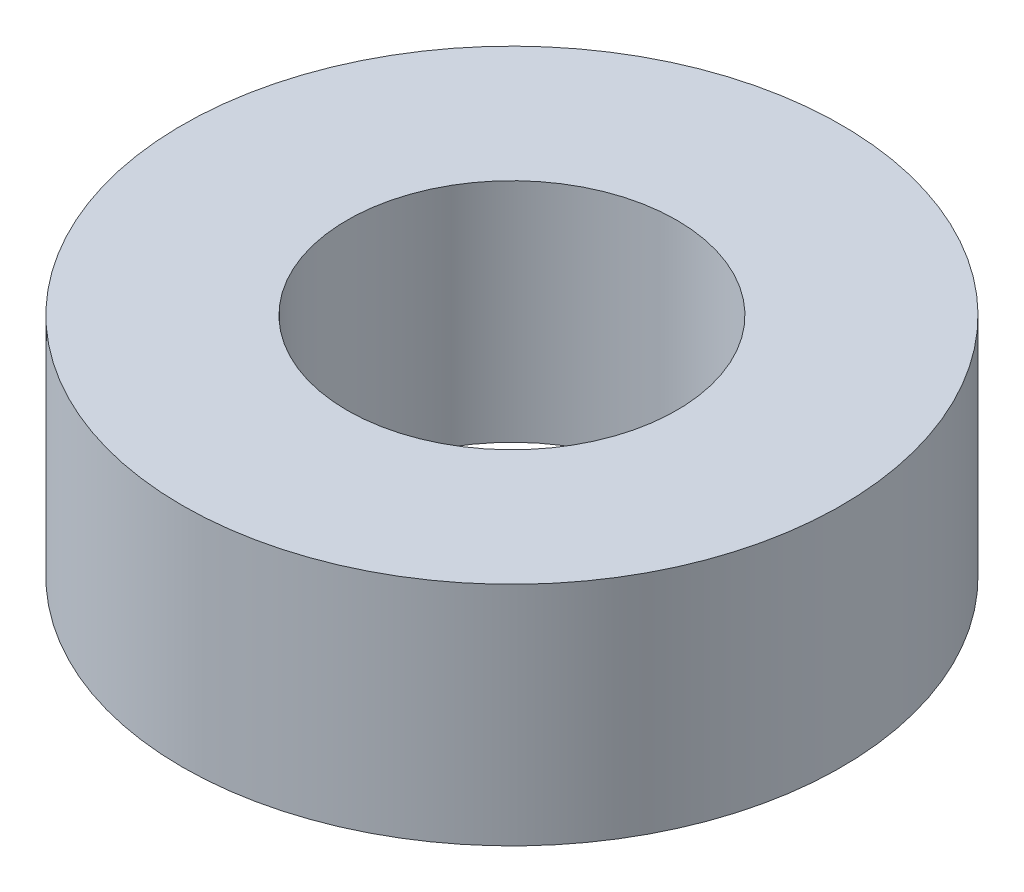
ISO-10303-21;
HEADER;
FILE_DESCRIPTION(('STEP AP214'),'2;1');
FILE_NAME('part.step','',(''),(''),'','','');
FILE_SCHEMA(('AUTOMOTIVE_DESIGN { 1 0 10303 214 1 1 1 1 }'));
ENDSEC;
DATA;
#1=APPLICATION_CONTEXT('core data for automotive mechanical design processes');
#2=APPLICATION_PROTOCOL_DEFINITION('international standard','automotive_design',2000,#1);
#3=PRODUCT_CONTEXT('',#1,'mechanical');
#4=PRODUCT('Part','Part','',(#3));
#5=PRODUCT_RELATED_PRODUCT_CATEGORY('part','',(#4));
#6=PRODUCT_DEFINITION_FORMATION('','',#4);
#7=PRODUCT_DEFINITION_CONTEXT('part definition',#1,'design');
#8=PRODUCT_DEFINITION('design','',#6,#7);
#9=PRODUCT_DEFINITION_SHAPE('','',#8);
#10=(LENGTH_UNIT() NAMED_UNIT(*) SI_UNIT(.MILLI.,.METRE.));
#11=(NAMED_UNIT(*) PLANE_ANGLE_UNIT() SI_UNIT($,.RADIAN.));
#12=(NAMED_UNIT(*) SI_UNIT($,.STERADIAN.) SOLID_ANGLE_UNIT());
#13=UNCERTAINTY_MEASURE_WITH_UNIT(LENGTH_MEASURE(1.E-05),#10,'distance_accuracy_value','');
#14=(GEOMETRIC_REPRESENTATION_CONTEXT(3) GLOBAL_UNCERTAINTY_ASSIGNED_CONTEXT((#13)) GLOBAL_UNIT_ASSIGNED_CONTEXT((#10,
#11,#12)) REPRESENTATION_CONTEXT('',''));
#15=CARTESIAN_POINT('',(0.,0.,0.));
#16=DIRECTION('',(0.,0.,1.));
#17=DIRECTION('',(1.,0.,0.));
#18=AXIS2_PLACEMENT_3D('',#15,#16,#17);
#19=CARTESIAN_POINT('',(0.,2.794,0.));
#20=DIRECTION('',(0.,1.,0.));
#21=DIRECTION('',(0.,0.,1.));
#22=AXIS2_PLACEMENT_3D('',#19,#20,#21);
#23=PLANE('',#22);
#24=CARTESIAN_POINT('',(0.,2.794,0.));
#25=DIRECTION('',(0.,1.,0.));
#26=DIRECTION('',(0.,0.,1.));
#27=AXIS2_PLACEMENT_3D('',#24,#25,#26);
#28=CIRCLE('',#27,4.064);
#29=CARTESIAN_POINT('',(0.,2.794,4.064));
#30=VERTEX_POINT('',#29);
#31=EDGE_CURVE('E10',#30,#30,#28,.T.);
#32=ORIENTED_EDGE('',*,*,#31,.T.);
#33=EDGE_LOOP('',(#32));
#34=FACE_BOUND('',#33,.T.);
#35=CARTESIAN_POINT('',(0.,2.794,0.));
#36=DIRECTION('',(0.,1.,0.));
#37=DIRECTION('',(0.,0.,1.));
#38=AXIS2_PLACEMENT_3D('',#35,#36,#37);
#39=CIRCLE('',#38,2.032);
#40=CARTESIAN_POINT('',(0.,2.794,2.032));
#41=VERTEX_POINT('',#40);
#42=EDGE_CURVE('E41',#41,#41,#39,.T.);
#43=ORIENTED_EDGE('',*,*,#42,.F.);
#44=EDGE_LOOP('',(#43));
#45=FACE_BOUND('',#44,.T.);
#46=ADVANCED_FACE('F30',(#34,#45),#23,.T.);
#47=CARTESIAN_POINT('',(0.,0.,0.));
#48=DIRECTION('',(0.,1.,0.));
#49=DIRECTION('',(0.,0.,1.));
#50=AXIS2_PLACEMENT_3D('',#47,#48,#49);
#51=PLANE('',#50);
#52=CARTESIAN_POINT('',(0.,0.,0.));
#53=DIRECTION('',(0.,1.,0.));
#54=DIRECTION('',(0.,0.,1.));
#55=AXIS2_PLACEMENT_3D('',#52,#53,#54);
#56=CIRCLE('',#55,4.064);
#57=CARTESIAN_POINT('',(0.,0.,4.064));
#58=VERTEX_POINT('',#57);
#59=EDGE_CURVE('E34',#58,#58,#56,.T.);
#60=ORIENTED_EDGE('',*,*,#59,.F.);
#61=EDGE_LOOP('',(#60));
#62=FACE_BOUND('',#61,.T.);
#63=CARTESIAN_POINT('',(0.,0.,0.));
#64=DIRECTION('',(0.,1.,0.));
#65=DIRECTION('',(0.,0.,1.));
#66=AXIS2_PLACEMENT_3D('',#63,#64,#65);
#67=CIRCLE('',#66,2.032);
#68=CARTESIAN_POINT('',(0.,0.,2.032));
#69=VERTEX_POINT('',#68);
#70=EDGE_CURVE('E43',#69,#69,#67,.T.);
#71=ORIENTED_EDGE('',*,*,#70,.T.);
#72=EDGE_LOOP('',(#71));
#73=FACE_BOUND('',#72,.T.);
#74=ADVANCED_FACE('F53',(#62,#73),#51,.F.);
#75=CARTESIAN_POINT('',(0.,2.794,0.));
#76=DIRECTION('',(0.,-1.,0.));
#77=DIRECTION('',(0.,0.,-1.));
#78=AXIS2_PLACEMENT_3D('',#75,#76,#77);
#79=CYLINDRICAL_SURFACE('',#78,4.064);
#80=ORIENTED_EDGE('',*,*,#31,.F.);
#81=EDGE_LOOP('',(#80));
#82=FACE_BOUND('',#81,.T.);
#83=ORIENTED_EDGE('',*,*,#59,.T.);
#84=EDGE_LOOP('',(#83));
#85=FACE_BOUND('',#84,.T.);
#86=ADVANCED_FACE('F32',(#82,#85),#79,.T.);
#87=CARTESIAN_POINT('',(0.,2.794,0.));
#88=DIRECTION('',(0.,-1.,0.));
#89=DIRECTION('',(0.,0.,-1.));
#90=AXIS2_PLACEMENT_3D('',#87,#88,#89);
#91=CYLINDRICAL_SURFACE('',#90,2.032);
#92=ORIENTED_EDGE('',*,*,#42,.T.);
#93=EDGE_LOOP('',(#92));
#94=FACE_BOUND('',#93,.T.);
#95=ORIENTED_EDGE('',*,*,#70,.F.);
#96=EDGE_LOOP('',(#95));
#97=FACE_BOUND('',#96,.T.);
#98=ADVANCED_FACE('F49',(#94,#97),#91,.F.);
#99=CLOSED_SHELL('',(#46,#74,#86,#98));
#100=MANIFOLD_SOLID_BREP('B2',#99);
#101=ADVANCED_BREP_SHAPE_REPRESENTATION('',(#18,#100),#14);
#102=SHAPE_DEFINITION_REPRESENTATION(#9,#101);
ENDSEC;
END-ISO-10303-21;
